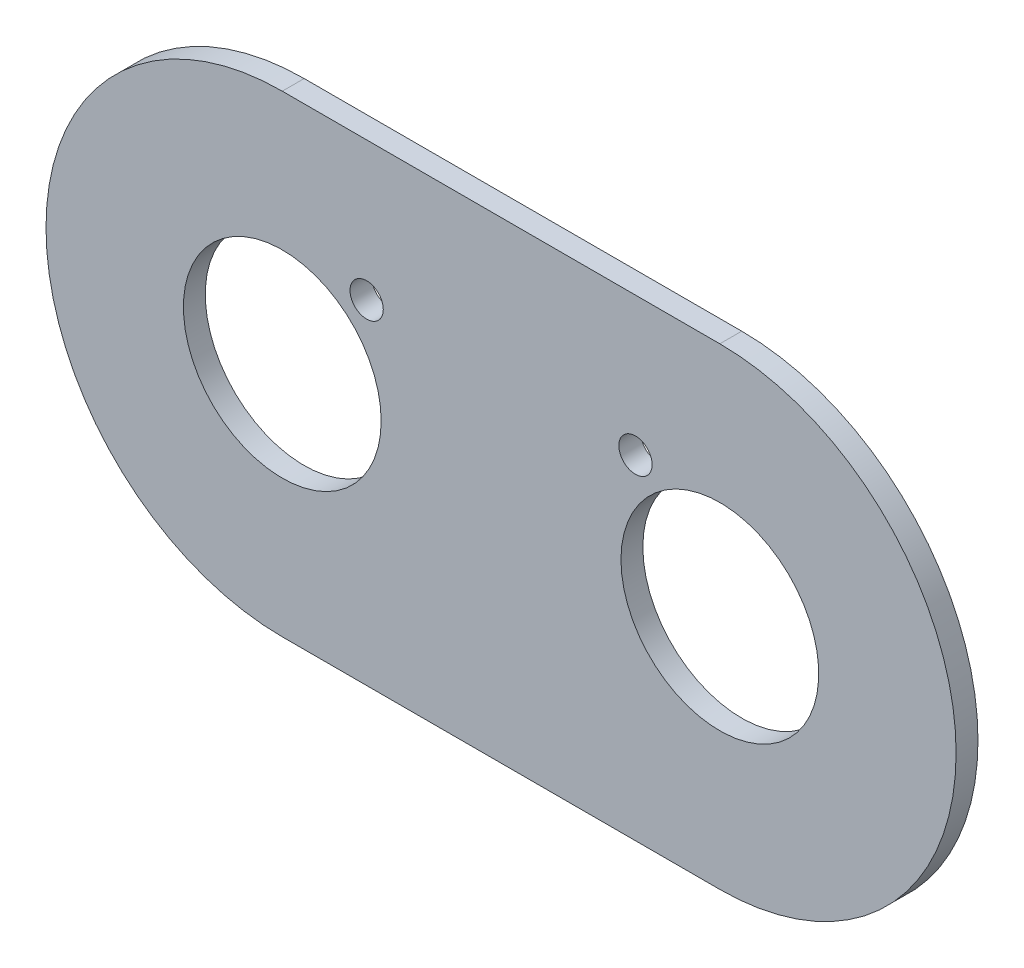
ISO-10303-21;
HEADER;
FILE_DESCRIPTION(('STEP AP214'),'2;1');
FILE_NAME('part.step','',(''),(''),'','','');
FILE_SCHEMA(('AUTOMOTIVE_DESIGN { 1 0 10303 214 1 1 1 1 }'));
ENDSEC;
DATA;
#1=APPLICATION_CONTEXT('core data for automotive mechanical design processes');
#2=APPLICATION_PROTOCOL_DEFINITION('international standard','automotive_design',2000,#1);
#3=PRODUCT_CONTEXT('',#1,'mechanical');
#4=PRODUCT('Part','Part','',(#3));
#5=PRODUCT_RELATED_PRODUCT_CATEGORY('part','',(#4));
#6=PRODUCT_DEFINITION_FORMATION('','',#4);
#7=PRODUCT_DEFINITION_CONTEXT('part definition',#1,'design');
#8=PRODUCT_DEFINITION('design','',#6,#7);
#9=PRODUCT_DEFINITION_SHAPE('','',#8);
#10=(LENGTH_UNIT() NAMED_UNIT(*) SI_UNIT(.MILLI.,.METRE.));
#11=(NAMED_UNIT(*) PLANE_ANGLE_UNIT() SI_UNIT($,.RADIAN.));
#12=(NAMED_UNIT(*) SI_UNIT($,.STERADIAN.) SOLID_ANGLE_UNIT());
#13=UNCERTAINTY_MEASURE_WITH_UNIT(LENGTH_MEASURE(1.E-05),#10,'distance_accuracy_value','');
#14=(GEOMETRIC_REPRESENTATION_CONTEXT(3) GLOBAL_UNCERTAINTY_ASSIGNED_CONTEXT((#13)) GLOBAL_UNIT_ASSIGNED_CONTEXT((#10,
#11,#12)) REPRESENTATION_CONTEXT('',''));
#15=CARTESIAN_POINT('',(0.,0.,0.));
#16=DIRECTION('',(0.,0.,1.));
#17=DIRECTION('',(1.,0.,0.));
#18=AXIS2_PLACEMENT_3D('',#15,#16,#17);
#19=CARTESIAN_POINT('',(-31.75,0.,3.175));
#20=DIRECTION('',(0.,0.,1.));
#21=DIRECTION('',(1.,0.,0.));
#22=AXIS2_PLACEMENT_3D('',#19,#20,#21);
#23=PLANE('',#22);
#24=CARTESIAN_POINT('',(-19.5063838861808,14.177461715957,3.175));
#25=DIRECTION('',(0.,0.,1.));
#26=DIRECTION('',(1.,0.,0.));
#27=AXIS2_PLACEMENT_3D('',#24,#25,#26);
#28=CIRCLE('',#27,2.413);
#29=CARTESIAN_POINT('',(-17.0933838861808,14.177461715957,3.175));
#30=VERTEX_POINT('',#29);
#31=EDGE_CURVE('E149',#30,#30,#28,.T.);
#32=ORIENTED_EDGE('',*,*,#31,.F.);
#33=EDGE_LOOP('',(#32));
#34=FACE_BOUND('',#33,.T.);
#35=CARTESIAN_POINT('',(-31.75,0.,3.175));
#36=DIRECTION('',(0.,0.,1.));
#37=DIRECTION('',(1.,0.,0.));
#38=AXIS2_PLACEMENT_3D('',#35,#36,#37);
#39=CIRCLE('',#38,14.351);
#40=CARTESIAN_POINT('',(-17.399,0.,3.175));
#41=VERTEX_POINT('',#40);
#42=EDGE_CURVE('E112',#41,#41,#39,.T.);
#43=ORIENTED_EDGE('',*,*,#42,.F.);
#44=EDGE_LOOP('',(#43));
#45=FACE_BOUND('',#44,.T.);
#46=CARTESIAN_POINT('',(-31.75,0.,3.175));
#47=DIRECTION('',(0.,0.,1.));
#48=DIRECTION('',(1.,0.,0.));
#49=AXIS2_PLACEMENT_3D('',#46,#47,#48);
#50=CIRCLE('',#49,34.29);
#51=CARTESIAN_POINT('',(-31.75,34.29,3.175));
#52=VERTEX_POINT('',#51);
#53=CARTESIAN_POINT('',(-31.75,-34.29,3.175));
#54=VERTEX_POINT('',#53);
#55=EDGE_CURVE('E98',#52,#54,#50,.T.);
#56=ORIENTED_EDGE('',*,*,#55,.T.);
#57=DIRECTION('',(1.,0.,0.));
#58=VECTOR('',#57,1.);
#59=CARTESIAN_POINT('',(-31.75,-34.29,3.175));
#60=LINE('',#59,#58);
#61=CARTESIAN_POINT('',(31.75,-34.29,3.175));
#62=VERTEX_POINT('',#61);
#63=EDGE_CURVE('E93',#54,#62,#60,.T.);
#64=ORIENTED_EDGE('',*,*,#63,.T.);
#65=CARTESIAN_POINT('',(31.75,0.,3.175));
#66=DIRECTION('',(0.,0.,1.));
#67=DIRECTION('',(-1.,0.,0.));
#68=AXIS2_PLACEMENT_3D('',#65,#66,#67);
#69=CIRCLE('',#68,34.29);
#70=CARTESIAN_POINT('',(31.75,34.29,3.175));
#71=VERTEX_POINT('',#70);
#72=EDGE_CURVE('E96',#62,#71,#69,.T.);
#73=ORIENTED_EDGE('',*,*,#72,.T.);
#74=DIRECTION('',(-1.,0.,0.));
#75=VECTOR('',#74,1.);
#76=CARTESIAN_POINT('',(-31.75,34.29,3.175));
#77=LINE('',#76,#75);
#78=EDGE_CURVE('E63',#71,#52,#77,.T.);
#79=ORIENTED_EDGE('',*,*,#78,.T.);
#80=EDGE_LOOP('',(#56,#64,#73,#79));
#81=FACE_BOUND('',#80,.T.);
#82=CARTESIAN_POINT('',(31.75,0.,3.175));
#83=DIRECTION('',(0.,0.,1.));
#84=DIRECTION('',(-1.,0.,0.));
#85=AXIS2_PLACEMENT_3D('',#82,#83,#84);
#86=CIRCLE('',#85,14.351);
#87=CARTESIAN_POINT('',(17.399,0.,3.175));
#88=VERTEX_POINT('',#87);
#89=EDGE_CURVE('E132',#88,#88,#86,.T.);
#90=ORIENTED_EDGE('',*,*,#89,.F.);
#91=EDGE_LOOP('',(#90));
#92=FACE_BOUND('',#91,.T.);
#93=CARTESIAN_POINT('',(19.5063838861808,14.177461715957,3.175));
#94=DIRECTION('',(0.,0.,1.));
#95=DIRECTION('',(-1.,0.,0.));
#96=AXIS2_PLACEMENT_3D('',#93,#94,#95);
#97=CIRCLE('',#96,2.413);
#98=CARTESIAN_POINT('',(17.0933838861808,14.177461715957,3.175));
#99=VERTEX_POINT('',#98);
#100=EDGE_CURVE('E150',#99,#99,#97,.T.);
#101=ORIENTED_EDGE('',*,*,#100,.F.);
#102=EDGE_LOOP('',(#101));
#103=FACE_BOUND('',#102,.T.);
#104=ADVANCED_FACE('F46',(#34,#45,#81,#92,#103),#23,.T.);
#105=CARTESIAN_POINT('',(-31.75,0.,0.));
#106=DIRECTION('',(0.,0.,1.));
#107=DIRECTION('',(1.,0.,0.));
#108=AXIS2_PLACEMENT_3D('',#105,#106,#107);
#109=PLANE('',#108);
#110=CARTESIAN_POINT('',(-31.75,0.,0.));
#111=DIRECTION('',(0.,0.,1.));
#112=DIRECTION('',(1.,0.,0.));
#113=AXIS2_PLACEMENT_3D('',#110,#111,#112);
#114=CIRCLE('',#113,34.29);
#115=CARTESIAN_POINT('',(-31.75,34.29,0.));
#116=VERTEX_POINT('',#115);
#117=CARTESIAN_POINT('',(-31.75,-34.29,0.));
#118=VERTEX_POINT('',#117);
#119=EDGE_CURVE('E109',#116,#118,#114,.T.);
#120=ORIENTED_EDGE('',*,*,#119,.F.);
#121=DIRECTION('',(-1.,0.,0.));
#122=VECTOR('',#121,1.);
#123=CARTESIAN_POINT('',(-31.75,34.29,0.));
#124=LINE('',#123,#122);
#125=CARTESIAN_POINT('',(31.75,34.29,0.));
#126=VERTEX_POINT('',#125);
#127=EDGE_CURVE('E86',#126,#116,#124,.T.);
#128=ORIENTED_EDGE('',*,*,#127,.F.);
#129=CARTESIAN_POINT('',(31.75,0.,0.));
#130=DIRECTION('',(0.,0.,1.));
#131=DIRECTION('',(-1.,0.,0.));
#132=AXIS2_PLACEMENT_3D('',#129,#130,#131);
#133=CIRCLE('',#132,34.29);
#134=CARTESIAN_POINT('',(31.75,-34.29,0.));
#135=VERTEX_POINT('',#134);
#136=EDGE_CURVE('E80',#135,#126,#133,.T.);
#137=ORIENTED_EDGE('',*,*,#136,.F.);
#138=DIRECTION('',(1.,0.,0.));
#139=VECTOR('',#138,1.);
#140=CARTESIAN_POINT('',(-31.75,-34.29,0.));
#141=LINE('',#140,#139);
#142=EDGE_CURVE('E102',#118,#135,#141,.T.);
#143=ORIENTED_EDGE('',*,*,#142,.F.);
#144=EDGE_LOOP('',(#120,#128,#137,#143));
#145=FACE_BOUND('',#144,.T.);
#146=CARTESIAN_POINT('',(-31.75,0.,0.));
#147=DIRECTION('',(0.,0.,1.));
#148=DIRECTION('',(1.,0.,0.));
#149=AXIS2_PLACEMENT_3D('',#146,#147,#148);
#150=CIRCLE('',#149,14.351);
#151=CARTESIAN_POINT('',(-17.399,0.,0.));
#152=VERTEX_POINT('',#151);
#153=EDGE_CURVE('E129',#152,#152,#150,.T.);
#154=ORIENTED_EDGE('',*,*,#153,.T.);
#155=EDGE_LOOP('',(#154));
#156=FACE_BOUND('',#155,.T.);
#157=CARTESIAN_POINT('',(31.75,0.,0.));
#158=DIRECTION('',(0.,0.,1.));
#159=DIRECTION('',(-1.,0.,0.));
#160=AXIS2_PLACEMENT_3D('',#157,#158,#159);
#161=CIRCLE('',#160,14.351);
#162=CARTESIAN_POINT('',(17.399,0.,0.));
#163=VERTEX_POINT('',#162);
#164=EDGE_CURVE('E137',#163,#163,#161,.T.);
#165=ORIENTED_EDGE('',*,*,#164,.T.);
#166=EDGE_LOOP('',(#165));
#167=FACE_BOUND('',#166,.T.);
#168=CARTESIAN_POINT('',(-19.5063838861808,14.177461715957,0.));
#169=DIRECTION('',(0.,0.,1.));
#170=DIRECTION('',(1.,0.,0.));
#171=AXIS2_PLACEMENT_3D('',#168,#169,#170);
#172=CIRCLE('',#171,2.413);
#173=CARTESIAN_POINT('',(-17.0933838861808,14.177461715957,0.));
#174=VERTEX_POINT('',#173);
#175=EDGE_CURVE('E146',#174,#174,#172,.T.);
#176=ORIENTED_EDGE('',*,*,#175,.T.);
#177=EDGE_LOOP('',(#176));
#178=FACE_BOUND('',#177,.T.);
#179=CARTESIAN_POINT('',(19.5063838861808,14.177461715957,0.));
#180=DIRECTION('',(0.,0.,1.));
#181=DIRECTION('',(-1.,0.,0.));
#182=AXIS2_PLACEMENT_3D('',#179,#180,#181);
#183=CIRCLE('',#182,2.413);
#184=CARTESIAN_POINT('',(17.0933838861808,14.177461715957,0.));
#185=VERTEX_POINT('',#184);
#186=EDGE_CURVE('E155',#185,#185,#183,.T.);
#187=ORIENTED_EDGE('',*,*,#186,.T.);
#188=EDGE_LOOP('',(#187));
#189=FACE_BOUND('',#188,.T.);
#190=ADVANCED_FACE('F121',(#145,#156,#167,#178,#189),#109,.F.);
#191=CARTESIAN_POINT('',(-31.75,0.,3.175));
#192=DIRECTION('',(0.,0.,-1.));
#193=DIRECTION('',(-1.,0.,0.));
#194=AXIS2_PLACEMENT_3D('',#191,#192,#193);
#195=CYLINDRICAL_SURFACE('',#194,34.29);
#196=ORIENTED_EDGE('',*,*,#119,.T.);
#197=DIRECTION('',(0.,0.,-1.));
#198=VECTOR('',#197,1.);
#199=CARTESIAN_POINT('',(-31.75,-34.29,3.175));
#200=LINE('',#199,#198);
#201=EDGE_CURVE('E12',#54,#118,#200,.T.);
#202=ORIENTED_EDGE('',*,*,#201,.F.);
#203=ORIENTED_EDGE('',*,*,#55,.F.);
#204=DIRECTION('',(0.,0.,-1.));
#205=VECTOR('',#204,1.);
#206=CARTESIAN_POINT('',(-31.75,34.29,3.175));
#207=LINE('',#206,#205);
#208=EDGE_CURVE('E106',#52,#116,#207,.T.);
#209=ORIENTED_EDGE('',*,*,#208,.T.);
#210=EDGE_LOOP('',(#196,#202,#203,#209));
#211=FACE_BOUND('',#210,.T.);
#212=ADVANCED_FACE('F48',(#211),#195,.T.);
#213=CARTESIAN_POINT('',(-31.75,-34.29,3.175));
#214=DIRECTION('',(0.,1.,0.));
#215=DIRECTION('',(0.,0.,1.));
#216=AXIS2_PLACEMENT_3D('',#213,#214,#215);
#217=PLANE('',#216);
#218=ORIENTED_EDGE('',*,*,#142,.T.);
#219=DIRECTION('',(0.,0.,-1.));
#220=VECTOR('',#219,1.);
#221=CARTESIAN_POINT('',(31.75,-34.29,3.175));
#222=LINE('',#221,#220);
#223=EDGE_CURVE('E55',#62,#135,#222,.T.);
#224=ORIENTED_EDGE('',*,*,#223,.F.);
#225=ORIENTED_EDGE('',*,*,#63,.F.);
#226=ORIENTED_EDGE('',*,*,#201,.T.);
#227=EDGE_LOOP('',(#218,#224,#225,#226));
#228=FACE_BOUND('',#227,.T.);
#229=ADVANCED_FACE('F101',(#228),#217,.F.);
#230=CARTESIAN_POINT('',(31.75,0.,3.175));
#231=DIRECTION('',(0.,0.,-1.));
#232=DIRECTION('',(-1.,0.,0.));
#233=AXIS2_PLACEMENT_3D('',#230,#231,#232);
#234=CYLINDRICAL_SURFACE('',#233,34.29);
#235=ORIENTED_EDGE('',*,*,#136,.T.);
#236=DIRECTION('',(0.,0.,-1.));
#237=VECTOR('',#236,1.);
#238=CARTESIAN_POINT('',(31.75,34.29,3.175));
#239=LINE('',#238,#237);
#240=EDGE_CURVE('E103',#71,#126,#239,.T.);
#241=ORIENTED_EDGE('',*,*,#240,.F.);
#242=ORIENTED_EDGE('',*,*,#72,.F.);
#243=ORIENTED_EDGE('',*,*,#223,.T.);
#244=EDGE_LOOP('',(#235,#241,#242,#243));
#245=FACE_BOUND('',#244,.T.);
#246=ADVANCED_FACE('F104',(#245),#234,.T.);
#247=CARTESIAN_POINT('',(-31.75,34.29,3.175));
#248=DIRECTION('',(0.,-1.,0.));
#249=DIRECTION('',(0.,0.,-1.));
#250=AXIS2_PLACEMENT_3D('',#247,#248,#249);
#251=PLANE('',#250);
#252=ORIENTED_EDGE('',*,*,#127,.T.);
#253=ORIENTED_EDGE('',*,*,#208,.F.);
#254=ORIENTED_EDGE('',*,*,#78,.F.);
#255=ORIENTED_EDGE('',*,*,#240,.T.);
#256=EDGE_LOOP('',(#252,#253,#254,#255));
#257=FACE_BOUND('',#256,.T.);
#258=ADVANCED_FACE('F117',(#257),#251,.F.);
#259=CARTESIAN_POINT('',(-31.75,0.,3.175));
#260=DIRECTION('',(0.,0.,-1.));
#261=DIRECTION('',(-1.,0.,0.));
#262=AXIS2_PLACEMENT_3D('',#259,#260,#261);
#263=CYLINDRICAL_SURFACE('',#262,14.351);
#264=ORIENTED_EDGE('',*,*,#42,.T.);
#265=EDGE_LOOP('',(#264));
#266=FACE_BOUND('',#265,.T.);
#267=ORIENTED_EDGE('',*,*,#153,.F.);
#268=EDGE_LOOP('',(#267));
#269=FACE_BOUND('',#268,.T.);
#270=ADVANCED_FACE('F177',(#266,#269),#263,.F.);
#271=CARTESIAN_POINT('',(31.75,0.,3.175));
#272=DIRECTION('',(0.,0.,-1.));
#273=DIRECTION('',(-1.,0.,0.));
#274=AXIS2_PLACEMENT_3D('',#271,#272,#273);
#275=CYLINDRICAL_SURFACE('',#274,14.351);
#276=ORIENTED_EDGE('',*,*,#89,.T.);
#277=EDGE_LOOP('',(#276));
#278=FACE_BOUND('',#277,.T.);
#279=ORIENTED_EDGE('',*,*,#164,.F.);
#280=EDGE_LOOP('',(#279));
#281=FACE_BOUND('',#280,.T.);
#282=ADVANCED_FACE('F237',(#278,#281),#275,.F.);
#283=CARTESIAN_POINT('',(-19.5063838861808,14.177461715957,3.175));
#284=DIRECTION('',(0.,0.,-1.));
#285=DIRECTION('',(-1.,0.,0.));
#286=AXIS2_PLACEMENT_3D('',#283,#284,#285);
#287=CYLINDRICAL_SURFACE('',#286,2.413);
#288=ORIENTED_EDGE('',*,*,#31,.T.);
#289=EDGE_LOOP('',(#288));
#290=FACE_BOUND('',#289,.T.);
#291=ORIENTED_EDGE('',*,*,#175,.F.);
#292=EDGE_LOOP('',(#291));
#293=FACE_BOUND('',#292,.T.);
#294=ADVANCED_FACE('F246',(#290,#293),#287,.F.);
#295=CARTESIAN_POINT('',(19.5063838861808,14.177461715957,3.175));
#296=DIRECTION('',(0.,0.,-1.));
#297=DIRECTION('',(-1.,0.,0.));
#298=AXIS2_PLACEMENT_3D('',#295,#296,#297);
#299=CYLINDRICAL_SURFACE('',#298,2.413);
#300=ORIENTED_EDGE('',*,*,#100,.T.);
#301=EDGE_LOOP('',(#300));
#302=FACE_BOUND('',#301,.T.);
#303=ORIENTED_EDGE('',*,*,#186,.F.);
#304=EDGE_LOOP('',(#303));
#305=FACE_BOUND('',#304,.T.);
#306=ADVANCED_FACE('F163',(#302,#305),#299,.F.);
#307=CLOSED_SHELL('',(#104,#190,#212,#229,#246,#258,#270,#282,#294,#306));
#308=MANIFOLD_SOLID_BREP('B2',#307);
#309=ADVANCED_BREP_SHAPE_REPRESENTATION('',(#18,#308),#14);
#310=SHAPE_DEFINITION_REPRESENTATION(#9,#309);
ENDSEC;
END-ISO-10303-21;
